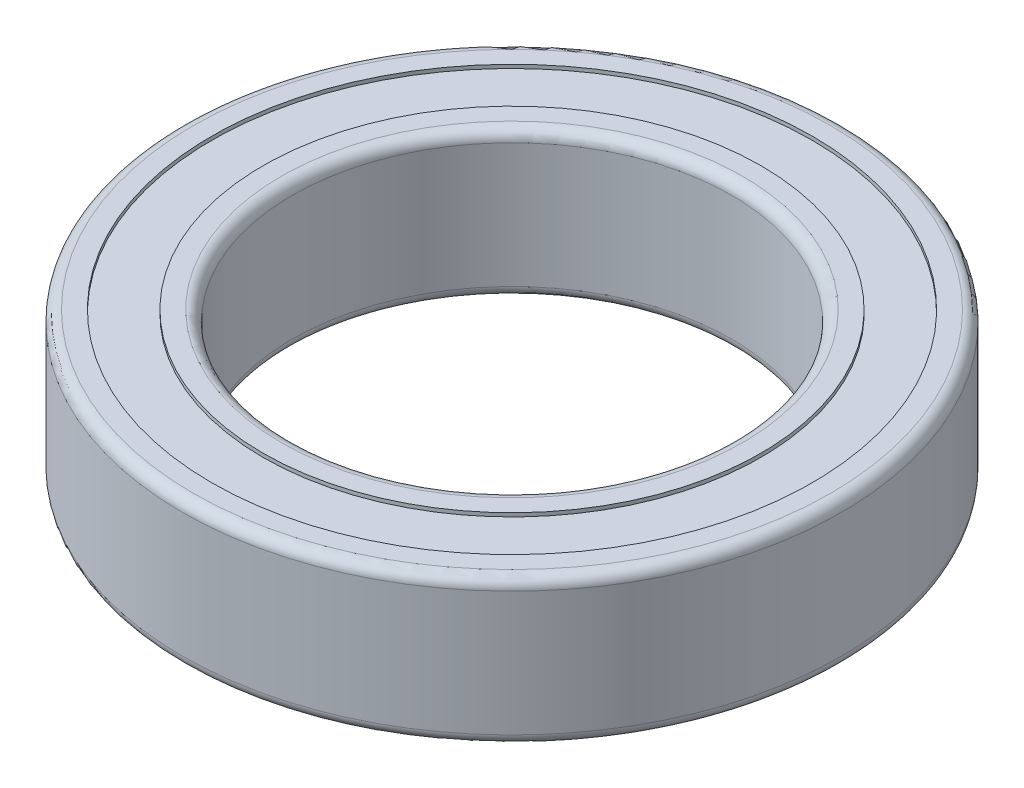
ISO-10303-21;
HEADER;
FILE_DESCRIPTION(('STEP AP214'),'2;1');
FILE_NAME('part.step','',(''),(''),'','','');
FILE_SCHEMA(('AUTOMOTIVE_DESIGN { 1 0 10303 214 1 1 1 1 }'));
ENDSEC;
DATA;
#1=APPLICATION_CONTEXT('core data for automotive mechanical design processes');
#2=APPLICATION_PROTOCOL_DEFINITION('international standard','automotive_design',2000,#1);
#3=PRODUCT_CONTEXT('',#1,'mechanical');
#4=PRODUCT('Part','Part','',(#3));
#5=PRODUCT_RELATED_PRODUCT_CATEGORY('part','',(#4));
#6=PRODUCT_DEFINITION_FORMATION('','',#4);
#7=PRODUCT_DEFINITION_CONTEXT('part definition',#1,'design');
#8=PRODUCT_DEFINITION('design','',#6,#7);
#9=PRODUCT_DEFINITION_SHAPE('','',#8);
#10=(LENGTH_UNIT() NAMED_UNIT(*) SI_UNIT(.MILLI.,.METRE.));
#11=(NAMED_UNIT(*) PLANE_ANGLE_UNIT() SI_UNIT($,.RADIAN.));
#12=(NAMED_UNIT(*) SI_UNIT($,.STERADIAN.) SOLID_ANGLE_UNIT());
#13=UNCERTAINTY_MEASURE_WITH_UNIT(LENGTH_MEASURE(1.E-05),#10,'distance_accuracy_value','');
#14=(GEOMETRIC_REPRESENTATION_CONTEXT(3) GLOBAL_UNCERTAINTY_ASSIGNED_CONTEXT((#13)) GLOBAL_UNIT_ASSIGNED_CONTEXT((#10,
#11,#12)) REPRESENTATION_CONTEXT('',''));
#15=CARTESIAN_POINT('',(0.,0.,0.));
#16=DIRECTION('',(0.,0.,1.));
#17=DIRECTION('',(1.,0.,0.));
#18=AXIS2_PLACEMENT_3D('',#15,#16,#17);
#19=CARTESIAN_POINT('',(0.,0.,0.));
#20=DIRECTION('',(0.,1.,0.));
#21=DIRECTION('',(0.,0.,1.));
#22=AXIS2_PLACEMENT_3D('',#19,#20,#21);
#23=PLANE('',#22);
#24=CARTESIAN_POINT('',(0.,0.,0.));
#25=DIRECTION('',(0.,1.,0.));
#26=DIRECTION('',(0.,0.,1.));
#27=AXIS2_PLACEMENT_3D('',#24,#25,#26);
#28=CIRCLE('',#27,6.3);
#29=CARTESIAN_POINT('',(0.,0.,6.3));
#30=VERTEX_POINT('',#29);
#31=EDGE_CURVE('E57',#30,#30,#28,.T.);
#32=ORIENTED_EDGE('',*,*,#31,.T.);
#33=EDGE_LOOP('',(#32));
#34=FACE_BOUND('',#33,.T.);
#35=CARTESIAN_POINT('',(0.,0.,0.));
#36=DIRECTION('',(0.,1.,0.));
#37=DIRECTION('',(0.,0.,1.));
#38=AXIS2_PLACEMENT_3D('',#35,#36,#37);
#39=CIRCLE('',#38,6.8);
#40=CARTESIAN_POINT('',(0.,0.,6.8));
#41=VERTEX_POINT('',#40);
#42=EDGE_CURVE('E88',#41,#41,#39,.T.);
#43=ORIENTED_EDGE('',*,*,#42,.F.);
#44=EDGE_LOOP('',(#43));
#45=FACE_BOUND('',#44,.T.);
#46=ADVANCED_FACE('F37',(#34,#45),#23,.F.);
#47=CARTESIAN_POINT('',(0.,4.,0.));
#48=DIRECTION('',(0.,1.,0.));
#49=DIRECTION('',(0.,0.,1.));
#50=AXIS2_PLACEMENT_3D('',#47,#48,#49);
#51=PLANE('',#50);
#52=CARTESIAN_POINT('',(0.,4.,0.));
#53=DIRECTION('',(0.,1.,0.));
#54=DIRECTION('',(0.,0.,1.));
#55=AXIS2_PLACEMENT_3D('',#52,#53,#54);
#56=CIRCLE('',#55,6.3);
#57=CARTESIAN_POINT('',(0.,4.,6.3));
#58=VERTEX_POINT('',#57);
#59=EDGE_CURVE('E60',#58,#58,#56,.F.);
#60=ORIENTED_EDGE('',*,*,#59,.T.);
#61=EDGE_LOOP('',(#60));
#62=FACE_BOUND('',#61,.T.);
#63=CARTESIAN_POINT('',(0.,4.,0.));
#64=DIRECTION('',(0.,1.,0.));
#65=DIRECTION('',(0.,0.,1.));
#66=AXIS2_PLACEMENT_3D('',#63,#64,#65);
#67=CIRCLE('',#66,6.8);
#68=CARTESIAN_POINT('',(0.,4.,6.8));
#69=VERTEX_POINT('',#68);
#70=EDGE_CURVE('E76',#69,#69,#67,.T.);
#71=ORIENTED_EDGE('',*,*,#70,.T.);
#72=EDGE_LOOP('',(#71));
#73=FACE_BOUND('',#72,.T.);
#74=ADVANCED_FACE('F105',(#62,#73),#51,.T.);
#75=CARTESIAN_POINT('',(0.,4.,0.));
#76=DIRECTION('',(0.,1.,0.));
#77=DIRECTION('',(0.,0.,1.));
#78=AXIS2_PLACEMENT_3D('',#75,#76,#77);
#79=CIRCLE('',#78,8.7);
#80=CARTESIAN_POINT('',(0.,4.,8.7));
#81=VERTEX_POINT('',#80);
#82=EDGE_CURVE('E10',#81,#81,#79,.T.);
#83=ORIENTED_EDGE('',*,*,#82,.T.);
#84=EDGE_LOOP('',(#83));
#85=FACE_BOUND('',#84,.T.);
#86=CARTESIAN_POINT('',(0.,4.,0.));
#87=DIRECTION('',(0.,1.,0.));
#88=DIRECTION('',(0.,0.,1.));
#89=AXIS2_PLACEMENT_3D('',#86,#87,#88);
#90=CIRCLE('',#89,8.2);
#91=CARTESIAN_POINT('',(0.,4.,8.2));
#92=VERTEX_POINT('',#91);
#93=EDGE_CURVE('E70',#92,#92,#90,.T.);
#94=ORIENTED_EDGE('',*,*,#93,.F.);
#95=EDGE_LOOP('',(#94));
#96=FACE_BOUND('',#95,.T.);
#97=ADVANCED_FACE('F112',(#85,#96),#51,.T.);
#98=CARTESIAN_POINT('',(0.,0.,0.));
#99=DIRECTION('',(0.,1.,0.));
#100=DIRECTION('',(0.,0.,1.));
#101=AXIS2_PLACEMENT_3D('',#98,#99,#100);
#102=CIRCLE('',#101,8.7);
#103=CARTESIAN_POINT('',(0.,0.,8.7));
#104=VERTEX_POINT('',#103);
#105=EDGE_CURVE('E44',#104,#104,#102,.F.);
#106=ORIENTED_EDGE('',*,*,#105,.T.);
#107=EDGE_LOOP('',(#106));
#108=FACE_BOUND('',#107,.T.);
#109=CARTESIAN_POINT('',(0.,0.,0.));
#110=DIRECTION('',(0.,1.,0.));
#111=DIRECTION('',(0.,0.,1.));
#112=AXIS2_PLACEMENT_3D('',#109,#110,#111);
#113=CIRCLE('',#112,8.2);
#114=CARTESIAN_POINT('',(0.,0.,8.2));
#115=VERTEX_POINT('',#114);
#116=EDGE_CURVE('E82',#115,#115,#113,.T.);
#117=ORIENTED_EDGE('',*,*,#116,.T.);
#118=EDGE_LOOP('',(#117));
#119=FACE_BOUND('',#118,.T.);
#120=ADVANCED_FACE('F108',(#108,#119),#23,.F.);
#121=CARTESIAN_POINT('',(0.,4.,0.));
#122=DIRECTION('',(0.,-1.,0.));
#123=DIRECTION('',(0.,0.,-1.));
#124=AXIS2_PLACEMENT_3D('',#121,#122,#123);
#125=CYLINDRICAL_SURFACE('',#124,9.);
#126=CARTESIAN_POINT('',(0.,0.3,0.));
#127=DIRECTION('',(0.,1.,0.));
#128=DIRECTION('',(0.,0.,1.));
#129=AXIS2_PLACEMENT_3D('',#126,#127,#128);
#130=CIRCLE('',#129,9.);
#131=CARTESIAN_POINT('',(0.,0.3,9.));
#132=VERTEX_POINT('',#131);
#133=EDGE_CURVE('E48',#132,#132,#130,.T.);
#134=ORIENTED_EDGE('',*,*,#133,.T.);
#135=EDGE_LOOP('',(#134));
#136=FACE_BOUND('',#135,.T.);
#137=CARTESIAN_POINT('',(0.,3.7,0.));
#138=DIRECTION('',(0.,1.,0.));
#139=DIRECTION('',(0.,0.,1.));
#140=AXIS2_PLACEMENT_3D('',#137,#138,#139);
#141=CIRCLE('',#140,9.);
#142=CARTESIAN_POINT('',(0.,3.7,9.));
#143=VERTEX_POINT('',#142);
#144=EDGE_CURVE('E52',#143,#143,#141,.F.);
#145=ORIENTED_EDGE('',*,*,#144,.T.);
#146=EDGE_LOOP('',(#145));
#147=FACE_BOUND('',#146,.T.);
#148=ADVANCED_FACE('F117',(#136,#147),#125,.T.);
#149=CARTESIAN_POINT('',(0.,4.,0.));
#150=DIRECTION('',(0.,-1.,0.));
#151=DIRECTION('',(0.,0.,-1.));
#152=AXIS2_PLACEMENT_3D('',#149,#150,#151);
#153=CYLINDRICAL_SURFACE('',#152,6.);
#154=CARTESIAN_POINT('',(0.,3.7,0.));
#155=DIRECTION('',(0.,1.,0.));
#156=DIRECTION('',(0.,0.,1.));
#157=AXIS2_PLACEMENT_3D('',#154,#155,#156);
#158=CIRCLE('',#157,6.);
#159=CARTESIAN_POINT('',(0.,3.7,6.));
#160=VERTEX_POINT('',#159);
#161=EDGE_CURVE('E63',#160,#160,#158,.T.);
#162=ORIENTED_EDGE('',*,*,#161,.T.);
#163=EDGE_LOOP('',(#162));
#164=FACE_BOUND('',#163,.T.);
#165=CARTESIAN_POINT('',(0.,0.3,0.));
#166=DIRECTION('',(0.,1.,0.));
#167=DIRECTION('',(0.,0.,1.));
#168=AXIS2_PLACEMENT_3D('',#165,#166,#167);
#169=CIRCLE('',#168,6.);
#170=CARTESIAN_POINT('',(0.,0.3,6.));
#171=VERTEX_POINT('',#170);
#172=EDGE_CURVE('E66',#171,#171,#169,.F.);
#173=ORIENTED_EDGE('',*,*,#172,.T.);
#174=EDGE_LOOP('',(#173));
#175=FACE_BOUND('',#174,.T.);
#176=ADVANCED_FACE('F122',(#164,#175),#153,.F.);
#177=CARTESIAN_POINT('',(0.,3.9,0.));
#178=DIRECTION('',(0.,1.,0.));
#179=DIRECTION('',(0.,0.,1.));
#180=AXIS2_PLACEMENT_3D('',#177,#178,#179);
#181=CYLINDRICAL_SURFACE('',#180,8.2);
#182=CARTESIAN_POINT('',(0.,3.9,0.));
#183=DIRECTION('',(0.,1.,0.));
#184=DIRECTION('',(0.,0.,1.));
#185=AXIS2_PLACEMENT_3D('',#182,#183,#184);
#186=CIRCLE('',#185,8.2);
#187=CARTESIAN_POINT('',(0.,3.9,8.2));
#188=VERTEX_POINT('',#187);
#189=EDGE_CURVE('E69',#188,#188,#186,.T.);
#190=ORIENTED_EDGE('',*,*,#189,.F.);
#191=EDGE_LOOP('',(#190));
#192=FACE_BOUND('',#191,.T.);
#193=ORIENTED_EDGE('',*,*,#93,.T.);
#194=EDGE_LOOP('',(#193));
#195=FACE_BOUND('',#194,.T.);
#196=ADVANCED_FACE('F143',(#192,#195),#181,.F.);
#197=CARTESIAN_POINT('',(0.,3.9,0.));
#198=DIRECTION('',(0.,1.,0.));
#199=DIRECTION('',(0.,0.,1.));
#200=AXIS2_PLACEMENT_3D('',#197,#198,#199);
#201=PLANE('',#200);
#202=CARTESIAN_POINT('',(0.,3.9,0.));
#203=DIRECTION('',(0.,1.,0.));
#204=DIRECTION('',(0.,0.,1.));
#205=AXIS2_PLACEMENT_3D('',#202,#203,#204);
#206=CIRCLE('',#205,6.8);
#207=CARTESIAN_POINT('',(0.,3.9,6.8));
#208=VERTEX_POINT('',#207);
#209=EDGE_CURVE('E73',#208,#208,#206,.T.);
#210=ORIENTED_EDGE('',*,*,#209,.F.);
#211=EDGE_LOOP('',(#210));
#212=FACE_BOUND('',#211,.T.);
#213=ORIENTED_EDGE('',*,*,#189,.T.);
#214=EDGE_LOOP('',(#213));
#215=FACE_BOUND('',#214,.T.);
#216=ADVANCED_FACE('F139',(#212,#215),#201,.T.);
#217=CARTESIAN_POINT('',(0.,3.9,0.));
#218=DIRECTION('',(0.,1.,0.));
#219=DIRECTION('',(0.,0.,1.));
#220=AXIS2_PLACEMENT_3D('',#217,#218,#219);
#221=CYLINDRICAL_SURFACE('',#220,6.8);
#222=ORIENTED_EDGE('',*,*,#209,.T.);
#223=EDGE_LOOP('',(#222));
#224=FACE_BOUND('',#223,.T.);
#225=ORIENTED_EDGE('',*,*,#70,.F.);
#226=EDGE_LOOP('',(#225));
#227=FACE_BOUND('',#226,.T.);
#228=ADVANCED_FACE('F133',(#224,#227),#221,.T.);
#229=CARTESIAN_POINT('',(0.,0.1,0.));
#230=DIRECTION('',(0.,-1.,0.));
#231=DIRECTION('',(0.,0.,1.));
#232=AXIS2_PLACEMENT_3D('',#229,#230,#231);
#233=PLANE('',#232);
#234=CARTESIAN_POINT('',(0.,0.1,0.));
#235=DIRECTION('',(0.,1.,0.));
#236=DIRECTION('',(0.,0.,1.));
#237=AXIS2_PLACEMENT_3D('',#234,#235,#236);
#238=CIRCLE('',#237,8.2);
#239=CARTESIAN_POINT('',(0.,0.1,8.2));
#240=VERTEX_POINT('',#239);
#241=EDGE_CURVE('E79',#240,#240,#238,.T.);
#242=ORIENTED_EDGE('',*,*,#241,.F.);
#243=EDGE_LOOP('',(#242));
#244=FACE_BOUND('',#243,.T.);
#245=CARTESIAN_POINT('',(0.,0.1,0.));
#246=DIRECTION('',(0.,1.,0.));
#247=DIRECTION('',(0.,0.,1.));
#248=AXIS2_PLACEMENT_3D('',#245,#246,#247);
#249=CIRCLE('',#248,6.8);
#250=CARTESIAN_POINT('',(0.,0.1,6.8));
#251=VERTEX_POINT('',#250);
#252=EDGE_CURVE('E85',#251,#251,#249,.T.);
#253=ORIENTED_EDGE('',*,*,#252,.T.);
#254=EDGE_LOOP('',(#253));
#255=FACE_BOUND('',#254,.T.);
#256=ADVANCED_FACE('F94',(#244,#255),#233,.T.);
#257=CARTESIAN_POINT('',(0.,0.1,0.));
#258=DIRECTION('',(0.,-1.,0.));
#259=DIRECTION('',(0.,0.,-1.));
#260=AXIS2_PLACEMENT_3D('',#257,#258,#259);
#261=CYLINDRICAL_SURFACE('',#260,8.2);
#262=ORIENTED_EDGE('',*,*,#241,.T.);
#263=EDGE_LOOP('',(#262));
#264=FACE_BOUND('',#263,.T.);
#265=ORIENTED_EDGE('',*,*,#116,.F.);
#266=EDGE_LOOP('',(#265));
#267=FACE_BOUND('',#266,.T.);
#268=ADVANCED_FACE('F100',(#264,#267),#261,.F.);
#269=CARTESIAN_POINT('',(0.,0.1,0.));
#270=DIRECTION('',(0.,-1.,0.));
#271=DIRECTION('',(0.,0.,-1.));
#272=AXIS2_PLACEMENT_3D('',#269,#270,#271);
#273=CYLINDRICAL_SURFACE('',#272,6.8);
#274=ORIENTED_EDGE('',*,*,#252,.F.);
#275=EDGE_LOOP('',(#274));
#276=FACE_BOUND('',#275,.T.);
#277=ORIENTED_EDGE('',*,*,#42,.T.);
#278=EDGE_LOOP('',(#277));
#279=FACE_BOUND('',#278,.T.);
#280=ADVANCED_FACE('F96',(#276,#279),#273,.T.);
#281=CARTESIAN_POINT('',(0.,3.7,0.));
#282=DIRECTION('',(0.,1.,0.));
#283=DIRECTION('',(0.,0.,1.));
#284=AXIS2_PLACEMENT_3D('',#281,#282,#283);
#285=TOROIDAL_SURFACE('',#284,6.3,0.3);
#286=ORIENTED_EDGE('',*,*,#59,.F.);
#287=EDGE_LOOP('',(#286));
#288=FACE_BOUND('',#287,.T.);
#289=ORIENTED_EDGE('',*,*,#161,.F.);
#290=EDGE_LOOP('',(#289));
#291=FACE_BOUND('',#290,.T.);
#292=ADVANCED_FACE('F99',(#288,#291),#285,.T.);
#293=CARTESIAN_POINT('',(0.,0.3,0.));
#294=DIRECTION('',(0.,1.,0.));
#295=DIRECTION('',(0.,0.,1.));
#296=AXIS2_PLACEMENT_3D('',#293,#294,#295);
#297=TOROIDAL_SURFACE('',#296,6.3,0.3);
#298=ORIENTED_EDGE('',*,*,#172,.F.);
#299=EDGE_LOOP('',(#298));
#300=FACE_BOUND('',#299,.T.);
#301=ORIENTED_EDGE('',*,*,#31,.F.);
#302=EDGE_LOOP('',(#301));
#303=FACE_BOUND('',#302,.T.);
#304=ADVANCED_FACE('F156',(#300,#303),#297,.T.);
#305=CARTESIAN_POINT('',(0.,0.3,0.));
#306=DIRECTION('',(0.,1.,0.));
#307=DIRECTION('',(0.,0.,1.));
#308=AXIS2_PLACEMENT_3D('',#305,#306,#307);
#309=TOROIDAL_SURFACE('',#308,8.7,0.3);
#310=ORIENTED_EDGE('',*,*,#105,.F.);
#311=EDGE_LOOP('',(#310));
#312=FACE_BOUND('',#311,.T.);
#313=ORIENTED_EDGE('',*,*,#133,.F.);
#314=EDGE_LOOP('',(#313));
#315=FACE_BOUND('',#314,.T.);
#316=ADVANCED_FACE('F159',(#312,#315),#309,.T.);
#317=CARTESIAN_POINT('',(0.,3.7,0.));
#318=DIRECTION('',(0.,1.,0.));
#319=DIRECTION('',(0.,0.,1.));
#320=AXIS2_PLACEMENT_3D('',#317,#318,#319);
#321=TOROIDAL_SURFACE('',#320,8.7,0.3);
#322=ORIENTED_EDGE('',*,*,#144,.F.);
#323=EDGE_LOOP('',(#322));
#324=FACE_BOUND('',#323,.T.);
#325=ORIENTED_EDGE('',*,*,#82,.F.);
#326=EDGE_LOOP('',(#325));
#327=FACE_BOUND('',#326,.T.);
#328=ADVANCED_FACE('F39',(#324,#327),#321,.T.);
#329=CLOSED_SHELL('',(#46,#74,#97,#120,#148,#176,#196,#216,#228,#256,#268,#280,#292,#304,#316,#328));
#330=MANIFOLD_SOLID_BREP('B2',#329);
#331=ADVANCED_BREP_SHAPE_REPRESENTATION('',(#18,#330),#14);
#332=SHAPE_DEFINITION_REPRESENTATION(#9,#331);
ENDSEC;
END-ISO-10303-21;
